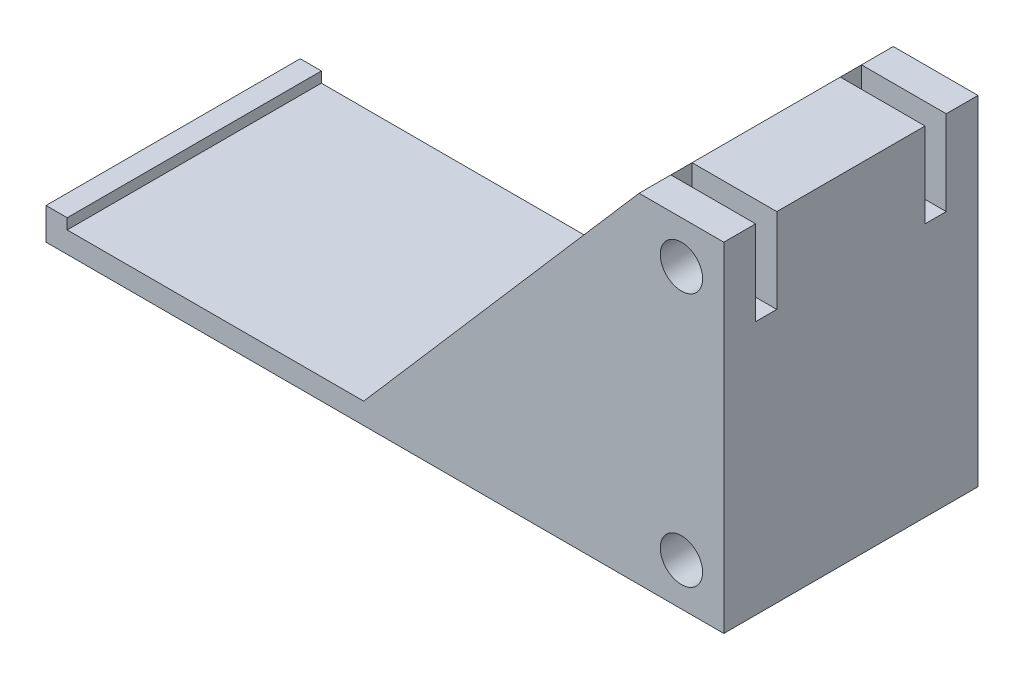
ISO-10303-21;
HEADER;
FILE_DESCRIPTION(('STEP AP214'),'2;1');
FILE_NAME('part.step','',(''),(''),'','','');
FILE_SCHEMA(('AUTOMOTIVE_DESIGN { 1 0 10303 214 1 1 1 1 }'));
ENDSEC;
DATA;
#1=APPLICATION_CONTEXT('core data for automotive mechanical design processes');
#2=APPLICATION_PROTOCOL_DEFINITION('international standard','automotive_design',2000,#1);
#3=PRODUCT_CONTEXT('',#1,'mechanical');
#4=PRODUCT('Part','Part','',(#3));
#5=PRODUCT_RELATED_PRODUCT_CATEGORY('part','',(#4));
#6=PRODUCT_DEFINITION_FORMATION('','',#4);
#7=PRODUCT_DEFINITION_CONTEXT('part definition',#1,'design');
#8=PRODUCT_DEFINITION('design','',#6,#7);
#9=PRODUCT_DEFINITION_SHAPE('','',#8);
#10=(LENGTH_UNIT() NAMED_UNIT(*) SI_UNIT(.MILLI.,.METRE.));
#11=(NAMED_UNIT(*) PLANE_ANGLE_UNIT() SI_UNIT($,.RADIAN.));
#12=(NAMED_UNIT(*) SI_UNIT($,.STERADIAN.) SOLID_ANGLE_UNIT());
#13=UNCERTAINTY_MEASURE_WITH_UNIT(LENGTH_MEASURE(1.E-05),#10,'distance_accuracy_value','');
#14=(GEOMETRIC_REPRESENTATION_CONTEXT(3) GLOBAL_UNCERTAINTY_ASSIGNED_CONTEXT((#13)) GLOBAL_UNIT_ASSIGNED_CONTEXT((#10,
#11,#12)) REPRESENTATION_CONTEXT('',''));
#15=CARTESIAN_POINT('',(0.,0.,0.));
#16=DIRECTION('',(0.,0.,1.));
#17=DIRECTION('',(1.,0.,0.));
#18=AXIS2_PLACEMENT_3D('',#15,#16,#17);
#19=CARTESIAN_POINT('',(0.,177.8,76.2));
#20=DIRECTION('',(0.,1.,0.));
#21=DIRECTION('',(-1.,0.,0.));
#22=AXIS2_PLACEMENT_3D('',#19,#20,#21);
#23=PLANE('',#22);
#24=DIRECTION('',(0.,0.,-1.));
#25=VECTOR('',#24,1.);
#26=CARTESIAN_POINT('',(25.4,177.8,76.2));
#27=LINE('',#26,#25);
#28=CARTESIAN_POINT('',(25.4,177.8,44.45));
#29=VERTEX_POINT('',#28);
#30=CARTESIAN_POINT('',(25.4,177.8,-44.45));
#31=VERTEX_POINT('',#30);
#32=EDGE_CURVE('E195',#29,#31,#27,.T.);
#33=ORIENTED_EDGE('',*,*,#32,.T.);
#34=DIRECTION('',(-1.,0.,0.));
#35=VECTOR('',#34,1.);
#36=CARTESIAN_POINT('',(25.4,177.8,-44.45));
#37=LINE('',#36,#35);
#38=CARTESIAN_POINT('',(-25.4,177.8,-44.45));
#39=VERTEX_POINT('',#38);
#40=EDGE_CURVE('E467',#31,#39,#37,.T.);
#41=ORIENTED_EDGE('',*,*,#40,.T.);
#42=DIRECTION('',(0.,0.,-1.));
#43=VECTOR('',#42,1.);
#44=CARTESIAN_POINT('',(-25.4,177.8,76.2));
#45=LINE('',#44,#43);
#46=CARTESIAN_POINT('',(-25.4,177.8,44.45));
#47=VERTEX_POINT('',#46);
#48=EDGE_CURVE('E44',#47,#39,#45,.T.);
#49=ORIENTED_EDGE('',*,*,#48,.F.);
#50=DIRECTION('',(-1.,0.,0.));
#51=VECTOR('',#50,1.);
#52=CARTESIAN_POINT('',(25.4,177.8,44.45));
#53=LINE('',#52,#51);
#54=EDGE_CURVE('E220',#29,#47,#53,.T.);
#55=ORIENTED_EDGE('',*,*,#54,.F.);
#56=EDGE_LOOP('',(#33,#41,#49,#55));
#57=FACE_BOUND('',#56,.T.);
#58=ADVANCED_FACE('F35',(#57),#23,.T.);
#59=CARTESIAN_POINT('',(25.4,0.,76.2));
#60=DIRECTION('',(1.,0.,0.));
#61=DIRECTION('',(0.,1.,0.));
#62=AXIS2_PLACEMENT_3D('',#59,#60,#61);
#63=PLANE('',#62);
#64=DIRECTION('',(0.,0.,-1.));
#65=VECTOR('',#64,1.);
#66=CARTESIAN_POINT('',(25.4,127.,-44.45));
#67=LINE('',#66,#65);
#68=CARTESIAN_POINT('',(25.4,127.,-44.45));
#69=VERTEX_POINT('',#68);
#70=CARTESIAN_POINT('',(25.4,127.,-57.15));
#71=VERTEX_POINT('',#70);
#72=EDGE_CURVE('E53',#69,#71,#67,.T.);
#73=ORIENTED_EDGE('',*,*,#72,.F.);
#74=DIRECTION('',(0.,1.,0.));
#75=VECTOR('',#74,1.);
#76=CARTESIAN_POINT('',(25.4,127.,-44.45));
#77=LINE('',#76,#75);
#78=EDGE_CURVE('E470',#69,#31,#77,.T.);
#79=ORIENTED_EDGE('',*,*,#78,.T.);
#80=ORIENTED_EDGE('',*,*,#32,.F.);
#81=DIRECTION('',(0.,1.,0.));
#82=VECTOR('',#81,1.);
#83=CARTESIAN_POINT('',(25.4,127.,44.45));
#84=LINE('',#83,#82);
#85=CARTESIAN_POINT('',(25.4,127.,44.45));
#86=VERTEX_POINT('',#85);
#87=EDGE_CURVE('E230',#86,#29,#84,.T.);
#88=ORIENTED_EDGE('',*,*,#87,.F.);
#89=DIRECTION('',(0.,0.,1.));
#90=VECTOR('',#89,1.);
#91=CARTESIAN_POINT('',(25.4,127.,44.45));
#92=LINE('',#91,#90);
#93=CARTESIAN_POINT('',(25.4,127.,57.15));
#94=VERTEX_POINT('',#93);
#95=EDGE_CURVE('E201',#86,#94,#92,.T.);
#96=ORIENTED_EDGE('',*,*,#95,.T.);
#97=DIRECTION('',(0.,1.,0.));
#98=VECTOR('',#97,1.);
#99=CARTESIAN_POINT('',(25.4,127.,57.15));
#100=LINE('',#99,#98);
#101=CARTESIAN_POINT('',(25.4,177.8,57.15));
#102=VERTEX_POINT('',#101);
#103=EDGE_CURVE('E224',#94,#102,#100,.T.);
#104=ORIENTED_EDGE('',*,*,#103,.T.);
#105=CARTESIAN_POINT('',(25.4,177.8,76.2));
#106=VERTEX_POINT('',#105);
#107=EDGE_CURVE('E192',#106,#102,#27,.T.);
#108=ORIENTED_EDGE('',*,*,#107,.F.);
#109=DIRECTION('',(0.,-1.,0.));
#110=VECTOR('',#109,1.);
#111=CARTESIAN_POINT('',(25.4,0.,76.2));
#112=LINE('',#111,#110);
#113=CARTESIAN_POINT('',(25.4,-25.4,76.2));
#114=VERTEX_POINT('',#113);
#115=EDGE_CURVE('E173',#106,#114,#112,.T.);
#116=ORIENTED_EDGE('',*,*,#115,.T.);
#117=DIRECTION('',(0.,0.,-1.));
#118=VECTOR('',#117,1.);
#119=CARTESIAN_POINT('',(25.4,-25.4,76.2));
#120=LINE('',#119,#118);
#121=CARTESIAN_POINT('',(25.4,-25.4,-76.2));
#122=VERTEX_POINT('',#121);
#123=EDGE_CURVE('E194',#114,#122,#120,.T.);
#124=ORIENTED_EDGE('',*,*,#123,.T.);
#125=DIRECTION('',(0.,-1.,0.));
#126=VECTOR('',#125,1.);
#127=CARTESIAN_POINT('',(25.4,0.,-76.2));
#128=LINE('',#127,#126);
#129=CARTESIAN_POINT('',(25.4,177.8,-76.2));
#130=VERTEX_POINT('',#129);
#131=EDGE_CURVE('E175',#130,#122,#128,.T.);
#132=ORIENTED_EDGE('',*,*,#131,.F.);
#133=CARTESIAN_POINT('',(25.4,177.8,-57.15));
#134=VERTEX_POINT('',#133);
#135=EDGE_CURVE('E186',#134,#130,#27,.T.);
#136=ORIENTED_EDGE('',*,*,#135,.F.);
#137=DIRECTION('',(0.,1.,0.));
#138=VECTOR('',#137,1.);
#139=CARTESIAN_POINT('',(25.4,127.,-57.15));
#140=LINE('',#139,#138);
#141=EDGE_CURVE('E479',#71,#134,#140,.T.);
#142=ORIENTED_EDGE('',*,*,#141,.F.);
#143=EDGE_LOOP('',(#73,#79,#80,#88,#96,#104,#108,#116,#124,#132,#136,#142));
#144=FACE_BOUND('',#143,.T.);
#145=ADVANCED_FACE('F271',(#144),#63,.T.);
#146=CARTESIAN_POINT('',(0.,152.4,-76.2));
#147=DIRECTION('',(0.,0.,1.));
#148=DIRECTION('',(1.,0.,0.));
#149=AXIS2_PLACEMENT_3D('',#146,#147,#148);
#150=CYLINDRICAL_SURFACE('',#149,12.7);
#151=CARTESIAN_POINT('',(0.,152.4,44.45));
#152=DIRECTION('',(0.,0.,1.));
#153=DIRECTION('',(1.,0.,0.));
#154=AXIS2_PLACEMENT_3D('',#151,#152,#153);
#155=CIRCLE('',#154,12.7);
#156=CARTESIAN_POINT('',(12.7,152.4,44.45));
#157=VERTEX_POINT('',#156);
#158=EDGE_CURVE('E200',#157,#157,#155,.F.);
#159=CARTESIAN_POINT('',(0.,152.4,-44.45));
#160=DIRECTION('',(0.,0.,-1.));
#161=DIRECTION('',(-1.,0.,0.));
#162=AXIS2_PLACEMENT_3D('',#159,#160,#161);
#163=CIRCLE('',#162,12.7);
#164=CARTESIAN_POINT('',(12.7,152.4,-44.45));
#165=VERTEX_POINT('',#164);
#166=EDGE_CURVE('E39',#165,#165,#163,.F.);
#167=CARTESIAN_POINT('',(12.7,152.4,44.45));
#168=CARTESIAN_POINT('',(12.7,152.4,43.5239583333333));
#169=CARTESIAN_POINT('',(12.7,152.4,42.5979166666666));
#170=CARTESIAN_POINT('',(12.7,152.4,40.7458333333333));
#171=CARTESIAN_POINT('',(12.7,152.4,39.8197916666667));
#172=CARTESIAN_POINT('',(12.7,152.4,37.9677083333333));
#173=CARTESIAN_POINT('',(12.7,152.4,37.0416666666667));
#174=CARTESIAN_POINT('',(12.7,152.4,35.1895833333333));
#175=CARTESIAN_POINT('',(12.7,152.4,34.2635416666667));
#176=CARTESIAN_POINT('',(12.7,152.4,32.4114583333333));
#177=CARTESIAN_POINT('',(12.7,152.4,31.4854166666667));
#178=CARTESIAN_POINT('',(12.7,152.4,29.6333333333333));
#179=CARTESIAN_POINT('',(12.7,152.4,28.7072916666667));
#180=CARTESIAN_POINT('',(12.7,152.4,26.8552083333333));
#181=CARTESIAN_POINT('',(12.7,152.4,25.9291666666667));
#182=CARTESIAN_POINT('',(12.7,152.4,24.0770833333333));
#183=CARTESIAN_POINT('',(12.7,152.4,23.1510416666667));
#184=CARTESIAN_POINT('',(12.7,152.4,21.2989583333333));
#185=CARTESIAN_POINT('',(12.7,152.4,20.3729166666667));
#186=CARTESIAN_POINT('',(12.7,152.4,18.5208333333333));
#187=CARTESIAN_POINT('',(12.7,152.4,17.5947916666667));
#188=CARTESIAN_POINT('',(12.7,152.4,15.7427083333333));
#189=CARTESIAN_POINT('',(12.7,152.4,14.8166666666667));
#190=CARTESIAN_POINT('',(12.7,152.4,12.9645833333333));
#191=CARTESIAN_POINT('',(12.7,152.4,12.0385416666667));
#192=CARTESIAN_POINT('',(12.7,152.4,10.1864583333333));
#193=CARTESIAN_POINT('',(12.7,152.4,9.26041666666666));
#194=CARTESIAN_POINT('',(12.7,152.4,7.40833333333332));
#195=CARTESIAN_POINT('',(12.7,152.4,6.48229166666665));
#196=CARTESIAN_POINT('',(12.7,152.4,4.63020833333332));
#197=CARTESIAN_POINT('',(12.7,152.4,3.70416666666666));
#198=CARTESIAN_POINT('',(12.7,152.4,1.85208333333333));
#199=CARTESIAN_POINT('',(12.7,152.4,0.926041666666664));
#200=CARTESIAN_POINT('',(12.7,152.4,-0.926041666666669));
#201=CARTESIAN_POINT('',(12.7,152.4,-1.85208333333334));
#202=CARTESIAN_POINT('',(12.7,152.4,-3.70416666666667));
#203=CARTESIAN_POINT('',(12.7,152.4,-4.63020833333334));
#204=CARTESIAN_POINT('',(12.7,152.4,-6.48229166666668));
#205=CARTESIAN_POINT('',(12.7,152.4,-7.40833333333334));
#206=CARTESIAN_POINT('',(12.7,152.4,-9.26041666666667));
#207=CARTESIAN_POINT('',(12.7,152.4,-10.1864583333333));
#208=CARTESIAN_POINT('',(12.7,152.4,-12.0385416666667));
#209=CARTESIAN_POINT('',(12.7,152.4,-12.9645833333333));
#210=CARTESIAN_POINT('',(12.7,152.4,-14.8166666666667));
#211=CARTESIAN_POINT('',(12.7,152.4,-15.7427083333333));
#212=CARTESIAN_POINT('',(12.7,152.4,-17.5947916666667));
#213=CARTESIAN_POINT('',(12.7,152.4,-18.5208333333333));
#214=CARTESIAN_POINT('',(12.7,152.4,-20.3729166666667));
#215=CARTESIAN_POINT('',(12.7,152.4,-21.2989583333333));
#216=CARTESIAN_POINT('',(12.7,152.4,-23.1510416666667));
#217=CARTESIAN_POINT('',(12.7,152.4,-24.0770833333333));
#218=CARTESIAN_POINT('',(12.7,152.4,-25.9291666666667));
#219=CARTESIAN_POINT('',(12.7,152.4,-26.8552083333333));
#220=CARTESIAN_POINT('',(12.7,152.4,-28.7072916666667));
#221=CARTESIAN_POINT('',(12.7,152.4,-29.6333333333333));
#222=CARTESIAN_POINT('',(12.7,152.4,-31.4854166666667));
#223=CARTESIAN_POINT('',(12.7,152.4,-32.4114583333333));
#224=CARTESIAN_POINT('',(12.7,152.4,-34.2635416666667));
#225=CARTESIAN_POINT('',(12.7,152.4,-35.1895833333333));
#226=CARTESIAN_POINT('',(12.7,152.4,-37.0416666666667));
#227=CARTESIAN_POINT('',(12.7,152.4,-37.9677083333333));
#228=CARTESIAN_POINT('',(12.7,152.4,-39.8197916666667));
#229=CARTESIAN_POINT('',(12.7,152.4,-40.7458333333333));
#230=CARTESIAN_POINT('',(12.7,152.4,-42.5979166666667));
#231=CARTESIAN_POINT('',(12.7,152.4,-43.5239583333333));
#232=CARTESIAN_POINT('',(12.7,152.4,-44.45));
#233=B_SPLINE_CURVE_WITH_KNOTS('',3,(#167,#168,#169,#170,#171,#172,#173,#174,#175,#176,#177,
#178,#179,#180,#181,#182,#183,#184,#185,#186,#187,#188,#189,#190,#191,#192,#193,#194,#195,#196,
#197,#198,#199,#200,#201,#202,#203,#204,#205,#206,#207,#208,#209,#210,#211,#212,#213,#214,#215,
#216,#217,#218,#219,#220,#221,#222,#223,#224,#225,#226,#227,#228,#229,#230,#231,#232),
.UNSPECIFIED.,.F.,.F.,(4,2,2,2,2,2,2,2,2,2,2,2,2,2,2,2,2,2,2,2,2,2,2,2,2,2,2,2,2,2,2,2,4),(0.,
2.77812500000001,5.55625,8.334375,11.1125,13.890625,16.66875,19.446875,22.225,25.003125,
27.78125,30.559375,33.3375,36.115625,38.89375,41.671875,44.45,47.228125,50.00625,52.784375,
55.5625,58.340625,61.11875,63.896875,66.675,69.453125,72.23125,75.009375,77.7875,80.565625,
83.34375,86.121875,88.9),.UNSPECIFIED.);
#234=EDGE_CURVE('BSEAM277',#157,#165,#233,.T.);
#235=ORIENTED_EDGE('',*,*,#158,.F.);
#236=ORIENTED_EDGE('',*,*,#166,.F.);
#237=ORIENTED_EDGE('',*,*,#234,.T.);
#238=ORIENTED_EDGE('',*,*,#234,.F.);
#239=EDGE_LOOP('',(#235,#237,#236,#238));
#240=FACE_BOUND('',#239,.T.);
#241=ADVANCED_FACE('F277',(#240),#150,.F.);
#242=DIRECTION('',(-1.,0.,0.));
#243=VECTOR('',#242,1.);
#244=CARTESIAN_POINT('',(25.4,177.8,-57.15));
#245=LINE('',#244,#243);
#246=CARTESIAN_POINT('',(-25.4,177.8,-57.15));
#247=VERTEX_POINT('',#246);
#248=EDGE_CURVE('E476',#134,#247,#245,.T.);
#249=ORIENTED_EDGE('',*,*,#248,.F.);
#250=ORIENTED_EDGE('',*,*,#135,.T.);
#251=DIRECTION('',(1.,0.,0.));
#252=VECTOR('',#251,1.);
#253=CARTESIAN_POINT('',(0.,177.8,-76.2));
#254=LINE('',#253,#252);
#255=CARTESIAN_POINT('',(-25.4,177.8,-76.2));
#256=VERTEX_POINT('',#255);
#257=EDGE_CURVE('E187',#256,#130,#254,.T.);
#258=ORIENTED_EDGE('',*,*,#257,.F.);
#259=EDGE_CURVE('E46',#247,#256,#45,.T.);
#260=ORIENTED_EDGE('',*,*,#259,.F.);
#261=EDGE_LOOP('',(#249,#250,#258,#260));
#262=FACE_BOUND('',#261,.T.);
#263=ADVANCED_FACE('F273',(#262),#23,.T.);
#264=CARTESIAN_POINT('',(0.,152.4,-57.15));
#265=DIRECTION('',(0.,0.,-1.));
#266=DIRECTION('',(-1.,0.,0.));
#267=AXIS2_PLACEMENT_3D('',#264,#265,#266);
#268=CIRCLE('',#267,12.7);
#269=CARTESIAN_POINT('',(12.7,152.4,-57.15));
#270=VERTEX_POINT('',#269);
#271=EDGE_CURVE('E204',#270,#270,#268,.F.);
#272=CARTESIAN_POINT('',(0.,152.4,-76.2));
#273=DIRECTION('',(0.,0.,1.));
#274=DIRECTION('',(1.,0.,0.));
#275=AXIS2_PLACEMENT_3D('',#272,#273,#274);
#276=CIRCLE('',#275,12.7);
#277=CARTESIAN_POINT('',(12.7,152.4,-76.2));
#278=VERTEX_POINT('',#277);
#279=EDGE_CURVE('E203',#278,#278,#276,.T.);
#280=CARTESIAN_POINT('',(12.7,152.4,-57.15));
#281=CARTESIAN_POINT('',(12.7,152.4,-57.3484375));
#282=CARTESIAN_POINT('',(12.7,152.4,-57.546875));
#283=CARTESIAN_POINT('',(12.7,152.4,-57.94375));
#284=CARTESIAN_POINT('',(12.7,152.4,-58.1421875));
#285=CARTESIAN_POINT('',(12.7,152.4,-58.5390625));
#286=CARTESIAN_POINT('',(12.7,152.4,-58.7375));
#287=CARTESIAN_POINT('',(12.7,152.4,-59.134375));
#288=CARTESIAN_POINT('',(12.7,152.4,-59.3328125));
#289=CARTESIAN_POINT('',(12.7,152.4,-59.7296875));
#290=CARTESIAN_POINT('',(12.7,152.4,-59.928125));
#291=CARTESIAN_POINT('',(12.7,152.4,-60.325));
#292=CARTESIAN_POINT('',(12.7,152.4,-60.5234375));
#293=CARTESIAN_POINT('',(12.7,152.4,-60.9203125));
#294=CARTESIAN_POINT('',(12.7,152.4,-61.11875));
#295=CARTESIAN_POINT('',(12.7,152.4,-61.515625));
#296=CARTESIAN_POINT('',(12.7,152.4,-61.7140625));
#297=CARTESIAN_POINT('',(12.7,152.4,-62.1109375));
#298=CARTESIAN_POINT('',(12.7,152.4,-62.309375));
#299=CARTESIAN_POINT('',(12.7,152.4,-62.70625));
#300=CARTESIAN_POINT('',(12.7,152.4,-62.9046875));
#301=CARTESIAN_POINT('',(12.7,152.4,-63.3015625));
#302=CARTESIAN_POINT('',(12.7,152.4,-63.5));
#303=CARTESIAN_POINT('',(12.7,152.4,-63.896875));
#304=CARTESIAN_POINT('',(12.7,152.4,-64.0953125));
#305=CARTESIAN_POINT('',(12.7,152.4,-64.4921875));
#306=CARTESIAN_POINT('',(12.7,152.4,-64.690625));
#307=CARTESIAN_POINT('',(12.7,152.4,-65.0875));
#308=CARTESIAN_POINT('',(12.7,152.4,-65.2859375));
#309=CARTESIAN_POINT('',(12.7,152.4,-65.6828125));
#310=CARTESIAN_POINT('',(12.7,152.4,-65.88125));
#311=CARTESIAN_POINT('',(12.7,152.4,-66.278125));
#312=CARTESIAN_POINT('',(12.7,152.4,-66.4765625));
#313=CARTESIAN_POINT('',(12.7,152.4,-66.8734375));
#314=CARTESIAN_POINT('',(12.7,152.4,-67.071875));
#315=CARTESIAN_POINT('',(12.7,152.4,-67.46875));
#316=CARTESIAN_POINT('',(12.7,152.4,-67.6671875));
#317=CARTESIAN_POINT('',(12.7,152.4,-68.0640625));
#318=CARTESIAN_POINT('',(12.7,152.4,-68.2625));
#319=CARTESIAN_POINT('',(12.7,152.4,-68.659375));
#320=CARTESIAN_POINT('',(12.7,152.4,-68.8578125));
#321=CARTESIAN_POINT('',(12.7,152.4,-69.2546875));
#322=CARTESIAN_POINT('',(12.7,152.4,-69.453125));
#323=CARTESIAN_POINT('',(12.7,152.4,-69.85));
#324=CARTESIAN_POINT('',(12.7,152.4,-70.0484375));
#325=CARTESIAN_POINT('',(12.7,152.4,-70.4453125));
#326=CARTESIAN_POINT('',(12.7,152.4,-70.64375));
#327=CARTESIAN_POINT('',(12.7,152.4,-71.040625));
#328=CARTESIAN_POINT('',(12.7,152.4,-71.2390625));
#329=CARTESIAN_POINT('',(12.7,152.4,-71.6359375));
#330=CARTESIAN_POINT('',(12.7,152.4,-71.834375));
#331=CARTESIAN_POINT('',(12.7,152.4,-72.23125));
#332=CARTESIAN_POINT('',(12.7,152.4,-72.4296875));
#333=CARTESIAN_POINT('',(12.7,152.4,-72.8265625));
#334=CARTESIAN_POINT('',(12.7,152.4,-73.025));
#335=CARTESIAN_POINT('',(12.7,152.4,-73.421875));
#336=CARTESIAN_POINT('',(12.7,152.4,-73.6203125));
#337=CARTESIAN_POINT('',(12.7,152.4,-74.0171875));
#338=CARTESIAN_POINT('',(12.7,152.4,-74.215625));
#339=CARTESIAN_POINT('',(12.7,152.4,-74.6125));
#340=CARTESIAN_POINT('',(12.7,152.4,-74.8109375));
#341=CARTESIAN_POINT('',(12.7,152.4,-75.2078125));
#342=CARTESIAN_POINT('',(12.7,152.4,-75.40625));
#343=CARTESIAN_POINT('',(12.7,152.4,-75.803125));
#344=CARTESIAN_POINT('',(12.7,152.4,-76.0015625));
#345=CARTESIAN_POINT('',(12.7,152.4,-76.2));
#346=B_SPLINE_CURVE_WITH_KNOTS('',3,(#280,#281,#282,#283,#284,#285,#286,#287,#288,#289,#290,
#291,#292,#293,#294,#295,#296,#297,#298,#299,#300,#301,#302,#303,#304,#305,#306,#307,#308,#309,
#310,#311,#312,#313,#314,#315,#316,#317,#318,#319,#320,#321,#322,#323,#324,#325,#326,#327,#328,
#329,#330,#331,#332,#333,#334,#335,#336,#337,#338,#339,#340,#341,#342,#343,#344,#345),
.UNSPECIFIED.,.F.,.F.,(4,2,2,2,2,2,2,2,2,2,2,2,2,2,2,2,2,2,2,2,2,2,2,2,2,2,2,2,2,2,2,2,4),(0.,
0.5953125,1.190625,1.7859375,2.38125,2.9765625,3.571875,4.1671875,4.7625,5.3578125,5.953125,
6.5484375,7.14375,7.7390625,8.334375,8.92968750000001,9.52500000000001,10.1203125,10.715625,
11.3109375,11.90625,12.5015625,13.096875,13.6921875,14.2875,14.8828125,15.478125,16.0734375,
16.66875,17.2640625,17.859375,18.4546875,19.05),.UNSPECIFIED.);
#347=EDGE_CURVE('BSEAM282',#270,#278,#346,.T.);
#348=ORIENTED_EDGE('',*,*,#271,.T.);
#349=ORIENTED_EDGE('',*,*,#279,.F.);
#350=ORIENTED_EDGE('',*,*,#347,.T.);
#351=ORIENTED_EDGE('',*,*,#347,.F.);
#352=EDGE_LOOP('',(#348,#350,#349,#351));
#353=FACE_BOUND('',#352,.T.);
#354=ADVANCED_FACE('F282',(#353),#150,.F.);
#355=DIRECTION('',(-1.,0.,0.));
#356=VECTOR('',#355,1.);
#357=CARTESIAN_POINT('',(25.4,177.8,57.15));
#358=LINE('',#357,#356);
#359=CARTESIAN_POINT('',(-25.4,177.8,57.15));
#360=VERTEX_POINT('',#359);
#361=EDGE_CURVE('E61',#102,#360,#358,.T.);
#362=ORIENTED_EDGE('',*,*,#361,.T.);
#363=CARTESIAN_POINT('',(-25.4,177.8,76.2));
#364=VERTEX_POINT('',#363);
#365=EDGE_CURVE('E11',#364,#360,#45,.T.);
#366=ORIENTED_EDGE('',*,*,#365,.F.);
#367=DIRECTION('',(1.,0.,0.));
#368=VECTOR('',#367,1.);
#369=CARTESIAN_POINT('',(0.,177.8,76.2));
#370=LINE('',#369,#368);
#371=EDGE_CURVE('E168',#364,#106,#370,.T.);
#372=ORIENTED_EDGE('',*,*,#371,.T.);
#373=ORIENTED_EDGE('',*,*,#107,.T.);
#374=EDGE_LOOP('',(#362,#366,#372,#373));
#375=FACE_BOUND('',#374,.T.);
#376=ADVANCED_FACE('F37',(#375),#23,.T.);
#377=CARTESIAN_POINT('',(0.,-25.4,76.2));
#378=DIRECTION('',(0.,1.,0.));
#379=DIRECTION('',(-1.,0.,0.));
#380=AXIS2_PLACEMENT_3D('',#377,#378,#379);
#381=PLANE('',#380);
#382=DIRECTION('',(1.,0.,0.));
#383=VECTOR('',#382,1.);
#384=CARTESIAN_POINT('',(0.,-25.4,-76.2));
#385=LINE('',#384,#383);
#386=CARTESIAN_POINT('',(-381.,-25.4,-76.2));
#387=VERTEX_POINT('',#386);
#388=EDGE_CURVE('E179',#387,#122,#385,.T.);
#389=ORIENTED_EDGE('',*,*,#388,.T.);
#390=ORIENTED_EDGE('',*,*,#123,.F.);
#391=DIRECTION('',(1.,0.,0.));
#392=VECTOR('',#391,1.);
#393=CARTESIAN_POINT('',(0.,-25.4,76.2));
#394=LINE('',#393,#392);
#395=CARTESIAN_POINT('',(-381.,-25.4,76.2));
#396=VERTEX_POINT('',#395);
#397=EDGE_CURVE('E174',#396,#114,#394,.T.);
#398=ORIENTED_EDGE('',*,*,#397,.F.);
#399=DIRECTION('',(0.,0.,-1.));
#400=VECTOR('',#399,1.);
#401=CARTESIAN_POINT('',(-381.,-25.4,76.2));
#402=LINE('',#401,#400);
#403=EDGE_CURVE('E440',#396,#387,#402,.T.);
#404=ORIENTED_EDGE('',*,*,#403,.T.);
#405=EDGE_LOOP('',(#389,#390,#398,#404));
#406=FACE_BOUND('',#405,.T.);
#407=ADVANCED_FACE('F259',(#406),#381,.F.);
#408=CARTESIAN_POINT('',(0.,0.,76.2));
#409=DIRECTION('',(0.,0.,1.));
#410=DIRECTION('',(1.,0.,0.));
#411=AXIS2_PLACEMENT_3D('',#408,#409,#410);
#412=PLANE('',#411);
#413=ORIENTED_EDGE('',*,*,#371,.F.);
#414=DIRECTION('',(-0.654930538417842,-0.755689082789818,0.));
#415=VECTOR('',#414,1.);
#416=CARTESIAN_POINT('',(-190.5,-12.7,76.2));
#417=LINE('',#416,#415);
#418=CARTESIAN_POINT('',(-190.5,-12.7,76.2));
#419=VERTEX_POINT('',#418);
#420=EDGE_CURVE('E153',#364,#419,#417,.T.);
#421=ORIENTED_EDGE('',*,*,#420,.T.);
#422=DIRECTION('',(-1.,0.,0.));
#423=VECTOR('',#422,1.);
#424=CARTESIAN_POINT('',(-368.3,-12.7,76.2));
#425=LINE('',#424,#423);
#426=CARTESIAN_POINT('',(-368.3,-12.7,76.2));
#427=VERTEX_POINT('',#426);
#428=EDGE_CURVE('E162',#419,#427,#425,.T.);
#429=ORIENTED_EDGE('',*,*,#428,.T.);
#430=DIRECTION('',(0.,1.,0.));
#431=VECTOR('',#430,1.);
#432=CARTESIAN_POINT('',(-368.3,-6.35000000000004,76.2));
#433=LINE('',#432,#431);
#434=CARTESIAN_POINT('',(-368.3,-6.35000000000004,76.2));
#435=VERTEX_POINT('',#434);
#436=EDGE_CURVE('E514',#427,#435,#433,.T.);
#437=ORIENTED_EDGE('',*,*,#436,.T.);
#438=DIRECTION('',(-1.,0.,0.));
#439=VECTOR('',#438,1.);
#440=CARTESIAN_POINT('',(-381.,-6.35000000000004,76.2));
#441=LINE('',#440,#439);
#442=CARTESIAN_POINT('',(-381.,-6.35000000000004,76.2));
#443=VERTEX_POINT('',#442);
#444=EDGE_CURVE('E453',#435,#443,#441,.T.);
#445=ORIENTED_EDGE('',*,*,#444,.T.);
#446=DIRECTION('',(0.,-1.,0.));
#447=VECTOR('',#446,1.);
#448=CARTESIAN_POINT('',(-381.,-25.4,76.2));
#449=LINE('',#448,#447);
#450=EDGE_CURVE('E449',#443,#396,#449,.T.);
#451=ORIENTED_EDGE('',*,*,#450,.T.);
#452=ORIENTED_EDGE('',*,*,#397,.T.);
#453=ORIENTED_EDGE('',*,*,#115,.F.);
#454=EDGE_LOOP('',(#413,#421,#429,#437,#445,#451,#452,#453));
#455=FACE_BOUND('',#454,.T.);
#456=CARTESIAN_POINT('',(0.,0.,76.2));
#457=DIRECTION('',(0.,0.,1.));
#458=DIRECTION('',(1.,0.,0.));
#459=AXIS2_PLACEMENT_3D('',#456,#457,#458);
#460=CIRCLE('',#459,12.7);
#461=CARTESIAN_POINT('',(12.7,0.,76.2));
#462=VERTEX_POINT('',#461);
#463=EDGE_CURVE('E182',#462,#462,#460,.T.);
#464=ORIENTED_EDGE('',*,*,#463,.F.);
#465=EDGE_LOOP('',(#464));
#466=FACE_BOUND('',#465,.T.);
#467=CARTESIAN_POINT('',(0.,152.4,76.2));
#468=DIRECTION('',(0.,0.,1.));
#469=DIRECTION('',(1.,0.,0.));
#470=AXIS2_PLACEMENT_3D('',#467,#468,#469);
#471=CIRCLE('',#470,12.7);
#472=CARTESIAN_POINT('',(12.7,152.4,76.2));
#473=VERTEX_POINT('',#472);
#474=EDGE_CURVE('E246',#473,#473,#471,.T.);
#475=ORIENTED_EDGE('',*,*,#474,.F.);
#476=EDGE_LOOP('',(#475));
#477=FACE_BOUND('',#476,.T.);
#478=ADVANCED_FACE('F170',(#455,#466,#477),#412,.T.);
#479=CARTESIAN_POINT('',(0.,0.,-76.2));
#480=DIRECTION('',(0.,0.,1.));
#481=DIRECTION('',(1.,0.,0.));
#482=AXIS2_PLACEMENT_3D('',#479,#480,#481);
#483=PLANE('',#482);
#484=CARTESIAN_POINT('',(0.,0.,-76.2));
#485=DIRECTION('',(0.,0.,1.));
#486=DIRECTION('',(1.,0.,0.));
#487=AXIS2_PLACEMENT_3D('',#484,#485,#486);
#488=CIRCLE('',#487,12.7);
#489=CARTESIAN_POINT('',(12.7,0.,-76.2));
#490=VERTEX_POINT('',#489);
#491=EDGE_CURVE('E243',#490,#490,#488,.T.);
#492=ORIENTED_EDGE('',*,*,#491,.T.);
#493=EDGE_LOOP('',(#492));
#494=FACE_BOUND('',#493,.T.);
#495=ORIENTED_EDGE('',*,*,#279,.T.);
#496=EDGE_LOOP('',(#495));
#497=FACE_BOUND('',#496,.T.);
#498=ORIENTED_EDGE('',*,*,#388,.F.);
#499=DIRECTION('',(0.,-1.,0.));
#500=VECTOR('',#499,1.);
#501=CARTESIAN_POINT('',(-381.,-25.4,-76.2));
#502=LINE('',#501,#500);
#503=CARTESIAN_POINT('',(-381.,-6.35000000000004,-76.2));
#504=VERTEX_POINT('',#503);
#505=EDGE_CURVE('E163',#504,#387,#502,.T.);
#506=ORIENTED_EDGE('',*,*,#505,.F.);
#507=DIRECTION('',(-1.,0.,0.));
#508=VECTOR('',#507,1.);
#509=CARTESIAN_POINT('',(-381.,-6.35000000000004,-76.2));
#510=LINE('',#509,#508);
#511=CARTESIAN_POINT('',(-368.3,-6.35000000000004,-76.2));
#512=VERTEX_POINT('',#511);
#513=EDGE_CURVE('E445',#512,#504,#510,.T.);
#514=ORIENTED_EDGE('',*,*,#513,.F.);
#515=DIRECTION('',(0.,1.,0.));
#516=VECTOR('',#515,1.);
#517=CARTESIAN_POINT('',(-368.3,-6.35000000000004,-76.2));
#518=LINE('',#517,#516);
#519=CARTESIAN_POINT('',(-368.3,-12.7,-76.2));
#520=VERTEX_POINT('',#519);
#521=EDGE_CURVE('E506',#520,#512,#518,.T.);
#522=ORIENTED_EDGE('',*,*,#521,.F.);
#523=DIRECTION('',(-1.,0.,0.));
#524=VECTOR('',#523,1.);
#525=CARTESIAN_POINT('',(-368.3,-12.7,-76.2));
#526=LINE('',#525,#524);
#527=CARTESIAN_POINT('',(-190.5,-12.7,-76.2));
#528=VERTEX_POINT('',#527);
#529=EDGE_CURVE('E504',#528,#520,#526,.T.);
#530=ORIENTED_EDGE('',*,*,#529,.F.);
#531=DIRECTION('',(-0.654930538417842,-0.755689082789818,0.));
#532=VECTOR('',#531,1.);
#533=CARTESIAN_POINT('',(-190.5,-12.7,-76.2));
#534=LINE('',#533,#532);
#535=EDGE_CURVE('E502',#256,#528,#534,.T.);
#536=ORIENTED_EDGE('',*,*,#535,.F.);
#537=ORIENTED_EDGE('',*,*,#257,.T.);
#538=ORIENTED_EDGE('',*,*,#131,.T.);
#539=EDGE_LOOP('',(#498,#506,#514,#522,#530,#536,#537,#538));
#540=FACE_BOUND('',#539,.T.);
#541=ADVANCED_FACE('F258',(#494,#497,#540),#483,.F.);
#542=CARTESIAN_POINT('',(0.,152.4,57.15));
#543=DIRECTION('',(0.,0.,1.));
#544=DIRECTION('',(1.,0.,0.));
#545=AXIS2_PLACEMENT_3D('',#542,#543,#544);
#546=CIRCLE('',#545,12.7);
#547=CARTESIAN_POINT('',(12.7,152.4,57.15));
#548=VERTEX_POINT('',#547);
#549=EDGE_CURVE('E197',#548,#548,#546,.F.);
#550=CARTESIAN_POINT('',(12.7,152.4,57.15));
#551=CARTESIAN_POINT('',(12.7,152.4,57.3484375));
#552=CARTESIAN_POINT('',(12.7,152.4,57.546875));
#553=CARTESIAN_POINT('',(12.7,152.4,57.94375));
#554=CARTESIAN_POINT('',(12.7,152.4,58.1421875));
#555=CARTESIAN_POINT('',(12.7,152.4,58.5390625));
#556=CARTESIAN_POINT('',(12.7,152.4,58.7375));
#557=CARTESIAN_POINT('',(12.7,152.4,59.134375));
#558=CARTESIAN_POINT('',(12.7,152.4,59.3328125));
#559=CARTESIAN_POINT('',(12.7,152.4,59.7296875));
#560=CARTESIAN_POINT('',(12.7,152.4,59.928125));
#561=CARTESIAN_POINT('',(12.7,152.4,60.325));
#562=CARTESIAN_POINT('',(12.7,152.4,60.5234375));
#563=CARTESIAN_POINT('',(12.7,152.4,60.9203125));
#564=CARTESIAN_POINT('',(12.7,152.4,61.11875));
#565=CARTESIAN_POINT('',(12.7,152.4,61.515625));
#566=CARTESIAN_POINT('',(12.7,152.4,61.7140625));
#567=CARTESIAN_POINT('',(12.7,152.4,62.1109375));
#568=CARTESIAN_POINT('',(12.7,152.4,62.309375));
#569=CARTESIAN_POINT('',(12.7,152.4,62.70625));
#570=CARTESIAN_POINT('',(12.7,152.4,62.9046875));
#571=CARTESIAN_POINT('',(12.7,152.4,63.3015625));
#572=CARTESIAN_POINT('',(12.7,152.4,63.5));
#573=CARTESIAN_POINT('',(12.7,152.4,63.896875));
#574=CARTESIAN_POINT('',(12.7,152.4,64.0953125));
#575=CARTESIAN_POINT('',(12.7,152.4,64.4921875));
#576=CARTESIAN_POINT('',(12.7,152.4,64.690625));
#577=CARTESIAN_POINT('',(12.7,152.4,65.0875));
#578=CARTESIAN_POINT('',(12.7,152.4,65.2859375));
#579=CARTESIAN_POINT('',(12.7,152.4,65.6828125));
#580=CARTESIAN_POINT('',(12.7,152.4,65.88125));
#581=CARTESIAN_POINT('',(12.7,152.4,66.278125));
#582=CARTESIAN_POINT('',(12.7,152.4,66.4765625));
#583=CARTESIAN_POINT('',(12.7,152.4,66.8734375));
#584=CARTESIAN_POINT('',(12.7,152.4,67.071875));
#585=CARTESIAN_POINT('',(12.7,152.4,67.46875));
#586=CARTESIAN_POINT('',(12.7,152.4,67.6671875));
#587=CARTESIAN_POINT('',(12.7,152.4,68.0640625));
#588=CARTESIAN_POINT('',(12.7,152.4,68.2625));
#589=CARTESIAN_POINT('',(12.7,152.4,68.659375));
#590=CARTESIAN_POINT('',(12.7,152.4,68.8578125));
#591=CARTESIAN_POINT('',(12.7,152.4,69.2546875));
#592=CARTESIAN_POINT('',(12.7,152.4,69.453125));
#593=CARTESIAN_POINT('',(12.7,152.4,69.85));
#594=CARTESIAN_POINT('',(12.7,152.4,70.0484375));
#595=CARTESIAN_POINT('',(12.7,152.4,70.4453125));
#596=CARTESIAN_POINT('',(12.7,152.4,70.64375));
#597=CARTESIAN_POINT('',(12.7,152.4,71.040625));
#598=CARTESIAN_POINT('',(12.7,152.4,71.2390625));
#599=CARTESIAN_POINT('',(12.7,152.4,71.6359375));
#600=CARTESIAN_POINT('',(12.7,152.4,71.834375));
#601=CARTESIAN_POINT('',(12.7,152.4,72.23125));
#602=CARTESIAN_POINT('',(12.7,152.4,72.4296875));
#603=CARTESIAN_POINT('',(12.7,152.4,72.8265625));
#604=CARTESIAN_POINT('',(12.7,152.4,73.025));
#605=CARTESIAN_POINT('',(12.7,152.4,73.421875));
#606=CARTESIAN_POINT('',(12.7,152.4,73.6203125));
#607=CARTESIAN_POINT('',(12.7,152.4,74.0171875));
#608=CARTESIAN_POINT('',(12.7,152.4,74.215625));
#609=CARTESIAN_POINT('',(12.7,152.4,74.6125));
#610=CARTESIAN_POINT('',(12.7,152.4,74.8109375));
#611=CARTESIAN_POINT('',(12.7,152.4,75.2078125));
#612=CARTESIAN_POINT('',(12.7,152.4,75.40625));
#613=CARTESIAN_POINT('',(12.7,152.4,75.803125));
#614=CARTESIAN_POINT('',(12.7,152.4,76.0015625));
#615=CARTESIAN_POINT('',(12.7,152.4,76.2));
#616=B_SPLINE_CURVE_WITH_KNOTS('',3,(#550,#551,#552,#553,#554,#555,#556,#557,#558,#559,#560,
#561,#562,#563,#564,#565,#566,#567,#568,#569,#570,#571,#572,#573,#574,#575,#576,#577,#578,#579,
#580,#581,#582,#583,#584,#585,#586,#587,#588,#589,#590,#591,#592,#593,#594,#595,#596,#597,#598,
#599,#600,#601,#602,#603,#604,#605,#606,#607,#608,#609,#610,#611,#612,#613,#614,#615),
.UNSPECIFIED.,.F.,.F.,(4,2,2,2,2,2,2,2,2,2,2,2,2,2,2,2,2,2,2,2,2,2,2,2,2,2,2,2,2,2,2,2,4),(0.,
0.5953125,1.190625,1.7859375,2.38125,2.9765625,3.571875,4.1671875,4.7625,5.3578125,5.953125,
6.5484375,7.14375,7.7390625,8.334375,8.92968750000001,9.52500000000001,10.1203125,10.715625,
11.3109375,11.90625,12.5015625,13.096875,13.6921875,14.2875,14.8828125,15.478125,16.0734375,
16.66875,17.2640625,17.859375,18.4546875,19.05),.UNSPECIFIED.);
#617=EDGE_CURVE('BSEAM265',#548,#473,#616,.T.);
#618=ORIENTED_EDGE('',*,*,#549,.T.);
#619=ORIENTED_EDGE('',*,*,#474,.T.);
#620=ORIENTED_EDGE('',*,*,#617,.T.);
#621=ORIENTED_EDGE('',*,*,#617,.F.);
#622=EDGE_LOOP('',(#618,#620,#619,#621));
#623=FACE_BOUND('',#622,.T.);
#624=ADVANCED_FACE('F265',(#623),#150,.F.);
#625=CARTESIAN_POINT('',(0.,0.,-76.2));
#626=DIRECTION('',(0.,0.,1.));
#627=DIRECTION('',(1.,0.,0.));
#628=AXIS2_PLACEMENT_3D('',#625,#626,#627);
#629=CYLINDRICAL_SURFACE('',#628,12.7);
#630=CARTESIAN_POINT('',(12.7,0.,76.2));
#631=CARTESIAN_POINT('',(12.7,0.,74.6125));
#632=CARTESIAN_POINT('',(12.7,0.,73.025));
#633=CARTESIAN_POINT('',(12.7,0.,69.85));
#634=CARTESIAN_POINT('',(12.7,0.,68.2625));
#635=CARTESIAN_POINT('',(12.7,0.,65.0875));
#636=CARTESIAN_POINT('',(12.7,0.,63.5));
#637=CARTESIAN_POINT('',(12.7,0.,60.325));
#638=CARTESIAN_POINT('',(12.7,0.,58.7375));
#639=CARTESIAN_POINT('',(12.7,0.,55.5625));
#640=CARTESIAN_POINT('',(12.7,0.,53.975));
#641=CARTESIAN_POINT('',(12.7,0.,50.8));
#642=CARTESIAN_POINT('',(12.7,0.,49.2125));
#643=CARTESIAN_POINT('',(12.7,0.,46.0375));
#644=CARTESIAN_POINT('',(12.7,0.,44.45));
#645=CARTESIAN_POINT('',(12.7,0.,41.275));
#646=CARTESIAN_POINT('',(12.7,0.,39.6875));
#647=CARTESIAN_POINT('',(12.7,0.,36.5125));
#648=CARTESIAN_POINT('',(12.7,0.,34.925));
#649=CARTESIAN_POINT('',(12.7,0.,31.75));
#650=CARTESIAN_POINT('',(12.7,0.,30.1625));
#651=CARTESIAN_POINT('',(12.7,0.,26.9875));
#652=CARTESIAN_POINT('',(12.7,0.,25.4));
#653=CARTESIAN_POINT('',(12.7,0.,22.225));
#654=CARTESIAN_POINT('',(12.7,0.,20.6375));
#655=CARTESIAN_POINT('',(12.7,0.,17.4625));
#656=CARTESIAN_POINT('',(12.7,0.,15.875));
#657=CARTESIAN_POINT('',(12.7,0.,12.7));
#658=CARTESIAN_POINT('',(12.7,0.,11.1125));
#659=CARTESIAN_POINT('',(12.7,0.,7.93750000000001));
#660=CARTESIAN_POINT('',(12.7,0.,6.35));
#661=CARTESIAN_POINT('',(12.7,0.,3.175));
#662=CARTESIAN_POINT('',(12.7,0.,1.5875));
#663=CARTESIAN_POINT('',(12.7,0.,-1.5875));
#664=CARTESIAN_POINT('',(12.7,0.,-3.175));
#665=CARTESIAN_POINT('',(12.7,0.,-6.35));
#666=CARTESIAN_POINT('',(12.7,0.,-7.9375));
#667=CARTESIAN_POINT('',(12.7,0.,-11.1125));
#668=CARTESIAN_POINT('',(12.7,0.,-12.7));
#669=CARTESIAN_POINT('',(12.7,0.,-15.875));
#670=CARTESIAN_POINT('',(12.7,0.,-17.4625));
#671=CARTESIAN_POINT('',(12.7,0.,-20.6375));
#672=CARTESIAN_POINT('',(12.7,0.,-22.225));
#673=CARTESIAN_POINT('',(12.7,0.,-25.4));
#674=CARTESIAN_POINT('',(12.7,0.,-26.9875));
#675=CARTESIAN_POINT('',(12.7,0.,-30.1625));
#676=CARTESIAN_POINT('',(12.7,0.,-31.75));
#677=CARTESIAN_POINT('',(12.7,0.,-34.925));
#678=CARTESIAN_POINT('',(12.7,0.,-36.5125));
#679=CARTESIAN_POINT('',(12.7,0.,-39.6875));
#680=CARTESIAN_POINT('',(12.7,0.,-41.275));
#681=CARTESIAN_POINT('',(12.7,0.,-44.45));
#682=CARTESIAN_POINT('',(12.7,0.,-46.0375));
#683=CARTESIAN_POINT('',(12.7,0.,-49.2125));
#684=CARTESIAN_POINT('',(12.7,0.,-50.8));
#685=CARTESIAN_POINT('',(12.7,0.,-53.975));
#686=CARTESIAN_POINT('',(12.7,0.,-55.5625));
#687=CARTESIAN_POINT('',(12.7,0.,-58.7375));
#688=CARTESIAN_POINT('',(12.7,0.,-60.325));
#689=CARTESIAN_POINT('',(12.7,0.,-63.5));
#690=CARTESIAN_POINT('',(12.7,0.,-65.0875));
#691=CARTESIAN_POINT('',(12.7,0.,-68.2625));
#692=CARTESIAN_POINT('',(12.7,0.,-69.85));
#693=CARTESIAN_POINT('',(12.7,0.,-73.025));
#694=CARTESIAN_POINT('',(12.7,0.,-74.6125));
#695=CARTESIAN_POINT('',(12.7,0.,-76.2));
#696=B_SPLINE_CURVE_WITH_KNOTS('',3,(#630,#631,#632,#633,#634,#635,#636,#637,#638,#639,#640,
#641,#642,#643,#644,#645,#646,#647,#648,#649,#650,#651,#652,#653,#654,#655,#656,#657,#658,#659,
#660,#661,#662,#663,#664,#665,#666,#667,#668,#669,#670,#671,#672,#673,#674,#675,#676,#677,#678,
#679,#680,#681,#682,#683,#684,#685,#686,#687,#688,#689,#690,#691,#692,#693,#694,#695),
.UNSPECIFIED.,.F.,.F.,(4,2,2,2,2,2,2,2,2,2,2,2,2,2,2,2,2,2,2,2,2,2,2,2,2,2,2,2,2,2,2,2,4),(0.,
4.7625,9.52500000000001,14.2875,19.05,23.8125,28.575,33.3375,38.1,42.8625,47.625,52.3875,57.15,
61.9125,66.675,71.4375,76.2,80.9625,85.725,90.4875,95.25,100.0125,104.775,109.5375,114.3,
119.0625,123.825,128.5875,133.35,138.1125,142.875,147.6375,152.4),.UNSPECIFIED.);
#697=EDGE_CURVE('BSEAM254',#462,#490,#696,.T.);
#698=ORIENTED_EDGE('',*,*,#463,.T.);
#699=ORIENTED_EDGE('',*,*,#491,.F.);
#700=ORIENTED_EDGE('',*,*,#697,.T.);
#701=ORIENTED_EDGE('',*,*,#697,.F.);
#702=EDGE_LOOP('',(#698,#700,#699,#701));
#703=FACE_BOUND('',#702,.T.);
#704=ADVANCED_FACE('F254',(#703),#629,.F.);
#705=CARTESIAN_POINT('',(0.,0.,44.45));
#706=DIRECTION('',(0.,0.,1.));
#707=DIRECTION('',(1.,0.,0.));
#708=AXIS2_PLACEMENT_3D('',#705,#706,#707);
#709=PLANE('',#708);
#710=ORIENTED_EDGE('',*,*,#54,.T.);
#711=DIRECTION('',(0.,-1.,0.));
#712=VECTOR('',#711,1.);
#713=CARTESIAN_POINT('',(-25.4,177.8,44.45));
#714=LINE('',#713,#712);
#715=CARTESIAN_POINT('',(-25.4,127.,44.45));
#716=VERTEX_POINT('',#715);
#717=EDGE_CURVE('E223',#47,#716,#714,.T.);
#718=ORIENTED_EDGE('',*,*,#717,.T.);
#719=DIRECTION('',(1.,0.,0.));
#720=VECTOR('',#719,1.);
#721=CARTESIAN_POINT('',(-25.4,127.,44.45));
#722=LINE('',#721,#720);
#723=EDGE_CURVE('E227',#716,#86,#722,.T.);
#724=ORIENTED_EDGE('',*,*,#723,.T.);
#725=ORIENTED_EDGE('',*,*,#87,.T.);
#726=EDGE_LOOP('',(#710,#718,#724,#725));
#727=FACE_BOUND('',#726,.T.);
#728=ORIENTED_EDGE('',*,*,#158,.T.);
#729=EDGE_LOOP('',(#728));
#730=FACE_BOUND('',#729,.T.);
#731=ADVANCED_FACE('F324',(#727,#730),#709,.T.);
#732=CARTESIAN_POINT('',(0.,0.,57.15));
#733=DIRECTION('',(0.,0.,1.));
#734=DIRECTION('',(1.,0.,0.));
#735=AXIS2_PLACEMENT_3D('',#732,#733,#734);
#736=PLANE('',#735);
#737=ORIENTED_EDGE('',*,*,#361,.F.);
#738=ORIENTED_EDGE('',*,*,#103,.F.);
#739=DIRECTION('',(1.,0.,0.));
#740=VECTOR('',#739,1.);
#741=CARTESIAN_POINT('',(-25.4,127.,57.15));
#742=LINE('',#741,#740);
#743=CARTESIAN_POINT('',(-25.4,127.,57.15));
#744=VERTEX_POINT('',#743);
#745=EDGE_CURVE('E236',#744,#94,#742,.T.);
#746=ORIENTED_EDGE('',*,*,#745,.F.);
#747=DIRECTION('',(0.,-1.,0.));
#748=VECTOR('',#747,1.);
#749=CARTESIAN_POINT('',(-25.4,177.8,57.15));
#750=LINE('',#749,#748);
#751=EDGE_CURVE('E234',#360,#744,#750,.T.);
#752=ORIENTED_EDGE('',*,*,#751,.F.);
#753=EDGE_LOOP('',(#737,#738,#746,#752));
#754=FACE_BOUND('',#753,.T.);
#755=ORIENTED_EDGE('',*,*,#549,.F.);
#756=EDGE_LOOP('',(#755));
#757=FACE_BOUND('',#756,.T.);
#758=ADVANCED_FACE('F315',(#754,#757),#736,.F.);
#759=CARTESIAN_POINT('',(-25.4,127.,44.45));
#760=DIRECTION('',(0.,-1.,0.));
#761=DIRECTION('',(0.,0.,-1.));
#762=AXIS2_PLACEMENT_3D('',#759,#760,#761);
#763=PLANE('',#762);
#764=ORIENTED_EDGE('',*,*,#745,.T.);
#765=ORIENTED_EDGE('',*,*,#95,.F.);
#766=ORIENTED_EDGE('',*,*,#723,.F.);
#767=DIRECTION('',(0.,0.,1.));
#768=VECTOR('',#767,1.);
#769=CARTESIAN_POINT('',(-25.4,127.,44.45));
#770=LINE('',#769,#768);
#771=EDGE_CURVE('E232',#716,#744,#770,.T.);
#772=ORIENTED_EDGE('',*,*,#771,.T.);
#773=EDGE_LOOP('',(#764,#765,#766,#772));
#774=FACE_BOUND('',#773,.T.);
#775=ADVANCED_FACE('F305',(#774),#763,.F.);
#776=CARTESIAN_POINT('',(0.,0.,-44.45));
#777=DIRECTION('',(0.,0.,-1.));
#778=DIRECTION('',(1.,0.,0.));
#779=AXIS2_PLACEMENT_3D('',#776,#777,#778);
#780=PLANE('',#779);
#781=ORIENTED_EDGE('',*,*,#40,.F.);
#782=ORIENTED_EDGE('',*,*,#78,.F.);
#783=DIRECTION('',(1.,0.,0.));
#784=VECTOR('',#783,1.);
#785=CARTESIAN_POINT('',(-25.4,127.,-44.45));
#786=LINE('',#785,#784);
#787=CARTESIAN_POINT('',(-25.4,127.,-44.45));
#788=VERTEX_POINT('',#787);
#789=EDGE_CURVE('E473',#788,#69,#786,.T.);
#790=ORIENTED_EDGE('',*,*,#789,.F.);
#791=DIRECTION('',(0.,-1.,0.));
#792=VECTOR('',#791,1.);
#793=CARTESIAN_POINT('',(-25.4,177.8,-44.45));
#794=LINE('',#793,#792);
#795=EDGE_CURVE('E214',#39,#788,#794,.T.);
#796=ORIENTED_EDGE('',*,*,#795,.F.);
#797=EDGE_LOOP('',(#781,#782,#790,#796));
#798=FACE_BOUND('',#797,.T.);
#799=ORIENTED_EDGE('',*,*,#166,.T.);
#800=EDGE_LOOP('',(#799));
#801=FACE_BOUND('',#800,.T.);
#802=ADVANCED_FACE('F302',(#798,#801),#780,.T.);
#803=CARTESIAN_POINT('',(0.,0.,-57.15));
#804=DIRECTION('',(0.,0.,-1.));
#805=DIRECTION('',(1.,0.,0.));
#806=AXIS2_PLACEMENT_3D('',#803,#804,#805);
#807=PLANE('',#806);
#808=ORIENTED_EDGE('',*,*,#248,.T.);
#809=DIRECTION('',(0.,-1.,0.));
#810=VECTOR('',#809,1.);
#811=CARTESIAN_POINT('',(-25.4,177.8,-57.15));
#812=LINE('',#811,#810);
#813=CARTESIAN_POINT('',(-25.4,127.,-57.15));
#814=VERTEX_POINT('',#813);
#815=EDGE_CURVE('E217',#247,#814,#812,.T.);
#816=ORIENTED_EDGE('',*,*,#815,.T.);
#817=DIRECTION('',(1.,0.,0.));
#818=VECTOR('',#817,1.);
#819=CARTESIAN_POINT('',(-25.4,127.,-57.15));
#820=LINE('',#819,#818);
#821=EDGE_CURVE('E480',#814,#71,#820,.T.);
#822=ORIENTED_EDGE('',*,*,#821,.T.);
#823=ORIENTED_EDGE('',*,*,#141,.T.);
#824=EDGE_LOOP('',(#808,#816,#822,#823));
#825=FACE_BOUND('',#824,.T.);
#826=ORIENTED_EDGE('',*,*,#271,.F.);
#827=EDGE_LOOP('',(#826));
#828=FACE_BOUND('',#827,.T.);
#829=ADVANCED_FACE('F304',(#825,#828),#807,.F.);
#830=CARTESIAN_POINT('',(-25.4,127.,-44.45));
#831=DIRECTION('',(0.,1.,0.));
#832=DIRECTION('',(0.,0.,1.));
#833=AXIS2_PLACEMENT_3D('',#830,#831,#832);
#834=PLANE('',#833);
#835=ORIENTED_EDGE('',*,*,#821,.F.);
#836=DIRECTION('',(0.,0.,-1.));
#837=VECTOR('',#836,1.);
#838=CARTESIAN_POINT('',(-25.4,127.,-44.45));
#839=LINE('',#838,#837);
#840=EDGE_CURVE('E206',#788,#814,#839,.T.);
#841=ORIENTED_EDGE('',*,*,#840,.F.);
#842=ORIENTED_EDGE('',*,*,#789,.T.);
#843=ORIENTED_EDGE('',*,*,#72,.T.);
#844=EDGE_LOOP('',(#835,#841,#842,#843));
#845=FACE_BOUND('',#844,.T.);
#846=ADVANCED_FACE('F312',(#845),#834,.T.);
#847=CARTESIAN_POINT('',(-25.4,177.8,76.2));
#848=DIRECTION('',(-1.,0.,0.));
#849=DIRECTION('',(0.,-1.,0.));
#850=AXIS2_PLACEMENT_3D('',#847,#848,#849);
#851=PLANE('',#850);
#852=DIRECTION('',(0.,0.,-1.));
#853=VECTOR('',#852,1.);
#854=CARTESIAN_POINT('',(-25.4,177.8,76.2));
#855=LINE('',#854,#853);
#856=EDGE_CURVE('E466',#360,#47,#855,.T.);
#857=ORIENTED_EDGE('',*,*,#856,.F.);
#858=ORIENTED_EDGE('',*,*,#751,.T.);
#859=ORIENTED_EDGE('',*,*,#771,.F.);
#860=ORIENTED_EDGE('',*,*,#717,.F.);
#861=EDGE_LOOP('',(#857,#858,#859,#860));
#862=FACE_BOUND('',#861,.T.);
#863=ADVANCED_FACE('F319',(#862),#851,.F.);
#864=EDGE_CURVE('E463',#39,#247,#855,.T.);
#865=ORIENTED_EDGE('',*,*,#864,.F.);
#866=ORIENTED_EDGE('',*,*,#795,.T.);
#867=ORIENTED_EDGE('',*,*,#840,.T.);
#868=ORIENTED_EDGE('',*,*,#815,.F.);
#869=EDGE_LOOP('',(#865,#866,#867,#868));
#870=FACE_BOUND('',#869,.T.);
#871=ADVANCED_FACE('F375',(#870),#851,.F.);
#872=CARTESIAN_POINT('',(-190.5,-12.7,76.2));
#873=DIRECTION('',(0.755689082789818,-0.654930538417842,0.));
#874=DIRECTION('',(0.654930538417842,0.755689082789818,0.));
#875=AXIS2_PLACEMENT_3D('',#872,#873,#874);
#876=PLANE('',#875);
#877=ORIENTED_EDGE('',*,*,#535,.T.);
#878=DIRECTION('',(0.,0.,-1.));
#879=VECTOR('',#878,1.);
#880=CARTESIAN_POINT('',(-190.5,-12.7,76.2));
#881=LINE('',#880,#879);
#882=EDGE_CURVE('E158',#419,#528,#881,.T.);
#883=ORIENTED_EDGE('',*,*,#882,.F.);
#884=ORIENTED_EDGE('',*,*,#420,.F.);
#885=ORIENTED_EDGE('',*,*,#365,.T.);
#886=ORIENTED_EDGE('',*,*,#856,.T.);
#887=ORIENTED_EDGE('',*,*,#48,.T.);
#888=ORIENTED_EDGE('',*,*,#864,.T.);
#889=ORIENTED_EDGE('',*,*,#259,.T.);
#890=EDGE_LOOP('',(#877,#883,#884,#885,#886,#887,#888,#889));
#891=FACE_BOUND('',#890,.T.);
#892=ADVANCED_FACE('F155',(#891),#876,.F.);
#893=CARTESIAN_POINT('',(-368.3,-12.7,76.2));
#894=DIRECTION('',(0.,-1.,0.));
#895=DIRECTION('',(0.,0.,-1.));
#896=AXIS2_PLACEMENT_3D('',#893,#894,#895);
#897=PLANE('',#896);
#898=ORIENTED_EDGE('',*,*,#529,.T.);
#899=DIRECTION('',(0.,0.,-1.));
#900=VECTOR('',#899,1.);
#901=CARTESIAN_POINT('',(-368.3,-12.7,76.2));
#902=LINE('',#901,#900);
#903=EDGE_CURVE('E459',#427,#520,#902,.T.);
#904=ORIENTED_EDGE('',*,*,#903,.F.);
#905=ORIENTED_EDGE('',*,*,#428,.F.);
#906=ORIENTED_EDGE('',*,*,#882,.T.);
#907=EDGE_LOOP('',(#898,#904,#905,#906));
#908=FACE_BOUND('',#907,.T.);
#909=ADVANCED_FACE('F392',(#908),#897,.F.);
#910=CARTESIAN_POINT('',(-368.3,-6.35000000000004,76.2));
#911=DIRECTION('',(-1.,0.,0.));
#912=DIRECTION('',(0.,0.,1.));
#913=AXIS2_PLACEMENT_3D('',#910,#911,#912);
#914=PLANE('',#913);
#915=ORIENTED_EDGE('',*,*,#521,.T.);
#916=DIRECTION('',(0.,0.,-1.));
#917=VECTOR('',#916,1.);
#918=CARTESIAN_POINT('',(-368.3,-6.35000000000004,76.2));
#919=LINE('',#918,#917);
#920=EDGE_CURVE('E451',#435,#512,#919,.T.);
#921=ORIENTED_EDGE('',*,*,#920,.F.);
#922=ORIENTED_EDGE('',*,*,#436,.F.);
#923=ORIENTED_EDGE('',*,*,#903,.T.);
#924=EDGE_LOOP('',(#915,#921,#922,#923));
#925=FACE_BOUND('',#924,.T.);
#926=ADVANCED_FACE('F400',(#925),#914,.F.);
#927=CARTESIAN_POINT('',(-381.,-6.35000000000004,76.2));
#928=DIRECTION('',(0.,-1.,0.));
#929=DIRECTION('',(0.,0.,-1.));
#930=AXIS2_PLACEMENT_3D('',#927,#928,#929);
#931=PLANE('',#930);
#932=ORIENTED_EDGE('',*,*,#513,.T.);
#933=DIRECTION('',(0.,0.,-1.));
#934=VECTOR('',#933,1.);
#935=CARTESIAN_POINT('',(-381.,-6.35000000000004,76.2));
#936=LINE('',#935,#934);
#937=EDGE_CURVE('E442',#443,#504,#936,.T.);
#938=ORIENTED_EDGE('',*,*,#937,.F.);
#939=ORIENTED_EDGE('',*,*,#444,.F.);
#940=ORIENTED_EDGE('',*,*,#920,.T.);
#941=EDGE_LOOP('',(#932,#938,#939,#940));
#942=FACE_BOUND('',#941,.T.);
#943=ADVANCED_FACE('F410',(#942),#931,.F.);
#944=CARTESIAN_POINT('',(-381.,-25.4,76.2));
#945=DIRECTION('',(1.,0.,0.));
#946=DIRECTION('',(0.,0.,-1.));
#947=AXIS2_PLACEMENT_3D('',#944,#945,#946);
#948=PLANE('',#947);
#949=ORIENTED_EDGE('',*,*,#505,.T.);
#950=ORIENTED_EDGE('',*,*,#403,.F.);
#951=ORIENTED_EDGE('',*,*,#450,.F.);
#952=ORIENTED_EDGE('',*,*,#937,.T.);
#953=EDGE_LOOP('',(#949,#950,#951,#952));
#954=FACE_BOUND('',#953,.T.);
#955=ADVANCED_FACE('F420',(#954),#948,.F.);
#956=CLOSED_SHELL('',(#58,#145,#241,#263,#354,#376,#407,#478,#541,#624,#704,#731,#758,#775,#802,
#829,#846,#863,#871,#892,#909,#926,#943,#955));
#957=MANIFOLD_SOLID_BREP('B2',#956);
#958=ADVANCED_BREP_SHAPE_REPRESENTATION('',(#18,#957),#14);
#959=SHAPE_DEFINITION_REPRESENTATION(#9,#958);
ENDSEC;
END-ISO-10303-21;
